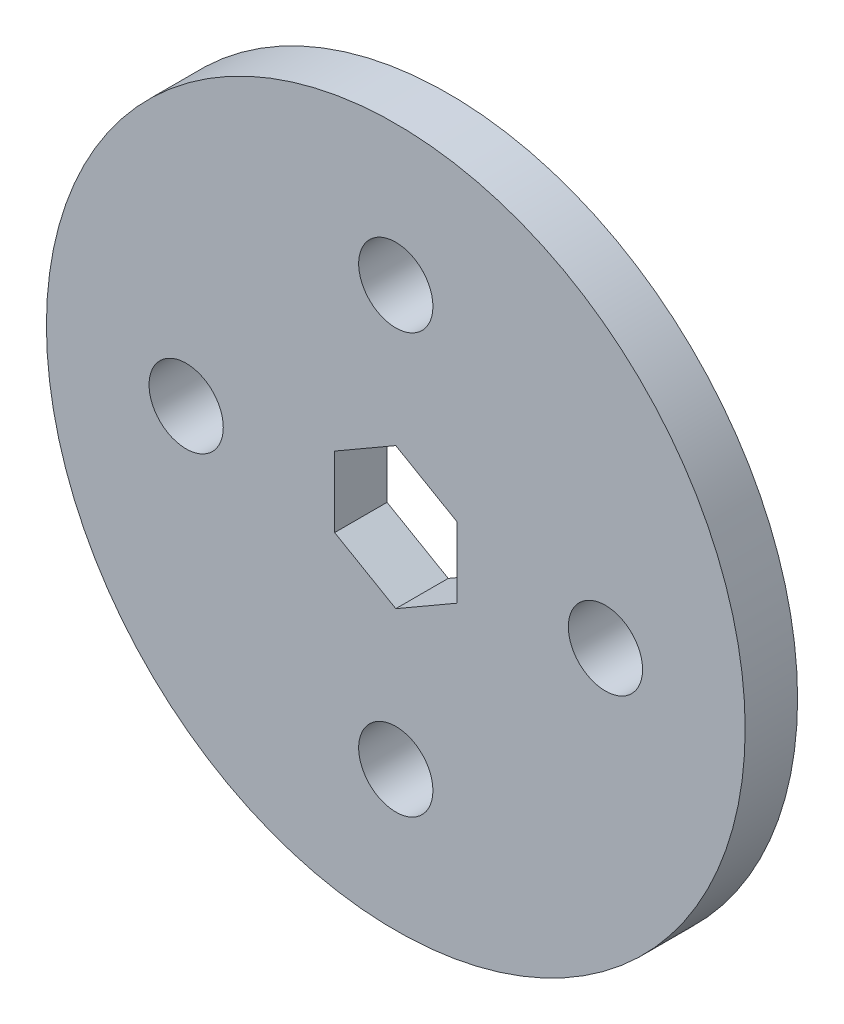
ISO-10303-21;
HEADER;
FILE_DESCRIPTION(('STEP AP214'),'2;1');
FILE_NAME('part.step','',(''),(''),'','','');
FILE_SCHEMA(('AUTOMOTIVE_DESIGN { 1 0 10303 214 1 1 1 1 }'));
ENDSEC;
DATA;
#1=APPLICATION_CONTEXT('core data for automotive mechanical design processes');
#2=APPLICATION_PROTOCOL_DEFINITION('international standard','automotive_design',2000,#1);
#3=PRODUCT_CONTEXT('',#1,'mechanical');
#4=PRODUCT('Part','Part','',(#3));
#5=PRODUCT_RELATED_PRODUCT_CATEGORY('part','',(#4));
#6=PRODUCT_DEFINITION_FORMATION('','',#4);
#7=PRODUCT_DEFINITION_CONTEXT('part definition',#1,'design');
#8=PRODUCT_DEFINITION('design','',#6,#7);
#9=PRODUCT_DEFINITION_SHAPE('','',#8);
#10=(LENGTH_UNIT() NAMED_UNIT(*) SI_UNIT(.MILLI.,.METRE.));
#11=(NAMED_UNIT(*) PLANE_ANGLE_UNIT() SI_UNIT($,.RADIAN.));
#12=(NAMED_UNIT(*) SI_UNIT($,.STERADIAN.) SOLID_ANGLE_UNIT());
#13=UNCERTAINTY_MEASURE_WITH_UNIT(LENGTH_MEASURE(1.E-05),#10,'distance_accuracy_value','');
#14=(GEOMETRIC_REPRESENTATION_CONTEXT(3) GLOBAL_UNCERTAINTY_ASSIGNED_CONTEXT((#13)) GLOBAL_UNIT_ASSIGNED_CONTEXT((#10,
#11,#12)) REPRESENTATION_CONTEXT('',''));
#15=CARTESIAN_POINT('',(0.,0.,0.));
#16=DIRECTION('',(0.,0.,1.));
#17=DIRECTION('',(1.,0.,0.));
#18=AXIS2_PLACEMENT_3D('',#15,#16,#17);
#19=CARTESIAN_POINT('',(0.,0.,3.));
#20=DIRECTION('',(0.,0.,-1.));
#21=DIRECTION('',(-1.,0.,0.));
#22=AXIS2_PLACEMENT_3D('',#19,#20,#21);
#23=CYLINDRICAL_SURFACE('',#22,20.);
#24=CARTESIAN_POINT('',(0.,0.,3.));
#25=DIRECTION('',(0.,0.,1.));
#26=DIRECTION('',(1.,0.,0.));
#27=AXIS2_PLACEMENT_3D('',#24,#25,#26);
#28=CIRCLE('',#27,20.);
#29=CARTESIAN_POINT('',(20.,0.,3.));
#30=VERTEX_POINT('',#29);
#31=EDGE_CURVE('E11',#30,#30,#28,.T.);
#32=ORIENTED_EDGE('',*,*,#31,.F.);
#33=EDGE_LOOP('',(#32));
#34=FACE_BOUND('',#33,.T.);
#35=CARTESIAN_POINT('',(0.,0.,0.));
#36=DIRECTION('',(0.,0.,1.));
#37=DIRECTION('',(1.,0.,0.));
#38=AXIS2_PLACEMENT_3D('',#35,#36,#37);
#39=CIRCLE('',#38,20.);
#40=CARTESIAN_POINT('',(20.,0.,0.));
#41=VERTEX_POINT('',#40);
#42=EDGE_CURVE('E54',#41,#41,#39,.T.);
#43=ORIENTED_EDGE('',*,*,#42,.T.);
#44=EDGE_LOOP('',(#43));
#45=FACE_BOUND('',#44,.T.);
#46=ADVANCED_FACE('F45',(#34,#45),#23,.T.);
#47=CARTESIAN_POINT('',(0.,0.,3.));
#48=DIRECTION('',(0.,0.,1.));
#49=DIRECTION('',(1.,0.,0.));
#50=AXIS2_PLACEMENT_3D('',#47,#48,#49);
#51=PLANE('',#50);
#52=CARTESIAN_POINT('',(0.,12.,3.));
#53=DIRECTION('',(0.,0.,1.));
#54=DIRECTION('',(1.,0.,0.));
#55=AXIS2_PLACEMENT_3D('',#52,#53,#54);
#56=CIRCLE('',#55,2.125);
#57=CARTESIAN_POINT('',(2.125,12.,3.));
#58=VERTEX_POINT('',#57);
#59=EDGE_CURVE('E181',#58,#58,#56,.T.);
#60=ORIENTED_EDGE('',*,*,#59,.F.);
#61=EDGE_LOOP('',(#60));
#62=FACE_BOUND('',#61,.T.);
#63=CARTESIAN_POINT('',(12.,0.,3.));
#64=DIRECTION('',(0.,0.,1.));
#65=DIRECTION('',(1.,0.,0.));
#66=AXIS2_PLACEMENT_3D('',#63,#64,#65);
#67=CIRCLE('',#66,2.125);
#68=CARTESIAN_POINT('',(14.125,0.,3.));
#69=VERTEX_POINT('',#68);
#70=EDGE_CURVE('E259',#69,#69,#67,.T.);
#71=ORIENTED_EDGE('',*,*,#70,.F.);
#72=EDGE_LOOP('',(#71));
#73=FACE_BOUND('',#72,.T.);
#74=CARTESIAN_POINT('',(0.,-12.,3.));
#75=DIRECTION('',(0.,0.,1.));
#76=DIRECTION('',(1.,0.,0.));
#77=AXIS2_PLACEMENT_3D('',#74,#75,#76);
#78=CIRCLE('',#77,2.125);
#79=CARTESIAN_POINT('',(2.12499999999992,-12.,3.));
#80=VERTEX_POINT('',#79);
#81=EDGE_CURVE('E251',#80,#80,#78,.T.);
#82=ORIENTED_EDGE('',*,*,#81,.F.);
#83=EDGE_LOOP('',(#82));
#84=FACE_BOUND('',#83,.T.);
#85=CARTESIAN_POINT('',(-12.,1.25693328198353E-13,3.));
#86=DIRECTION('',(0.,0.,1.));
#87=DIRECTION('',(1.,0.,0.));
#88=AXIS2_PLACEMENT_3D('',#85,#86,#87);
#89=CIRCLE('',#88,2.125);
#90=CARTESIAN_POINT('',(-9.875,1.25693328198353E-13,3.));
#91=VERTEX_POINT('',#90);
#92=EDGE_CURVE('E129',#91,#91,#89,.T.);
#93=ORIENTED_EDGE('',*,*,#92,.F.);
#94=EDGE_LOOP('',(#93));
#95=FACE_BOUND('',#94,.T.);
#96=DIRECTION('',(-0.866025403784442,0.499999999999994,0.));
#97=VECTOR('',#96,1.);
#98=CARTESIAN_POINT('',(3.49999999999999,2.02072594216372,3.));
#99=LINE('',#98,#97);
#100=CARTESIAN_POINT('',(3.49999999999999,2.02072594216372,3.));
#101=VERTEX_POINT('',#100);
#102=CARTESIAN_POINT('',(0.,4.04145188432738,3.));
#103=VERTEX_POINT('',#102);
#104=EDGE_CURVE('E62',#101,#103,#99,.T.);
#105=ORIENTED_EDGE('',*,*,#104,.F.);
#106=DIRECTION('',(0.,1.,0.));
#107=VECTOR('',#106,1.);
#108=CARTESIAN_POINT('',(3.50000000000002,-2.02072594216367,3.));
#109=LINE('',#108,#107);
#110=CARTESIAN_POINT('',(3.50000000000002,-2.02072594216367,3.));
#111=VERTEX_POINT('',#110);
#112=EDGE_CURVE('E122',#111,#101,#109,.T.);
#113=ORIENTED_EDGE('',*,*,#112,.F.);
#114=DIRECTION('',(0.866025403784435,0.500000000000006,0.));
#115=VECTOR('',#114,1.);
#116=CARTESIAN_POINT('',(0.,-4.04145188432738,3.));
#117=LINE('',#116,#115);
#118=CARTESIAN_POINT('',(0.,-4.04145188432738,3.));
#119=VERTEX_POINT('',#118);
#120=EDGE_CURVE('E126',#119,#111,#117,.T.);
#121=ORIENTED_EDGE('',*,*,#120,.F.);
#122=DIRECTION('',(0.866025403784442,-0.499999999999994,0.));
#123=VECTOR('',#122,1.);
#124=CARTESIAN_POINT('',(-3.49999999999998,-2.02072594216372,3.));
#125=LINE('',#124,#123);
#126=CARTESIAN_POINT('',(-3.49999999999998,-2.02072594216372,3.));
#127=VERTEX_POINT('',#126);
#128=EDGE_CURVE('E152',#127,#119,#125,.T.);
#129=ORIENTED_EDGE('',*,*,#128,.F.);
#130=DIRECTION('',(0.,-1.,0.));
#131=VECTOR('',#130,1.);
#132=CARTESIAN_POINT('',(-3.50000000000002,2.02072594216367,3.));
#133=LINE('',#132,#131);
#134=CARTESIAN_POINT('',(-3.50000000000002,2.02072594216367,3.));
#135=VERTEX_POINT('',#134);
#136=EDGE_CURVE('E148',#135,#127,#133,.T.);
#137=ORIENTED_EDGE('',*,*,#136,.F.);
#138=DIRECTION('',(-0.866025403784435,-0.500000000000006,0.));
#139=VECTOR('',#138,1.);
#140=CARTESIAN_POINT('',(0.,4.04145188432738,3.));
#141=LINE('',#140,#139);
#142=EDGE_CURVE('E145',#103,#135,#141,.T.);
#143=ORIENTED_EDGE('',*,*,#142,.F.);
#144=EDGE_LOOP('',(#105,#113,#121,#129,#137,#143));
#145=FACE_BOUND('',#144,.T.);
#146=ORIENTED_EDGE('',*,*,#31,.T.);
#147=EDGE_LOOP('',(#146));
#148=FACE_BOUND('',#147,.T.);
#149=ADVANCED_FACE('F207',(#62,#73,#84,#95,#145,#148),#51,.T.);
#150=CARTESIAN_POINT('',(0.,0.,0.));
#151=DIRECTION('',(0.,0.,1.));
#152=DIRECTION('',(1.,0.,0.));
#153=AXIS2_PLACEMENT_3D('',#150,#151,#152);
#154=PLANE('',#153);
#155=CARTESIAN_POINT('',(0.,12.,0.));
#156=DIRECTION('',(0.,0.,1.));
#157=DIRECTION('',(1.,0.,0.));
#158=AXIS2_PLACEMENT_3D('',#155,#156,#157);
#159=CIRCLE('',#158,2.125);
#160=CARTESIAN_POINT('',(2.125,12.,0.));
#161=VERTEX_POINT('',#160);
#162=EDGE_CURVE('E48',#161,#161,#159,.T.);
#163=ORIENTED_EDGE('',*,*,#162,.T.);
#164=EDGE_LOOP('',(#163));
#165=FACE_BOUND('',#164,.T.);
#166=CARTESIAN_POINT('',(12.,0.,0.));
#167=DIRECTION('',(0.,0.,1.));
#168=DIRECTION('',(1.,0.,0.));
#169=AXIS2_PLACEMENT_3D('',#166,#167,#168);
#170=CIRCLE('',#169,2.125);
#171=CARTESIAN_POINT('',(14.125,0.,0.));
#172=VERTEX_POINT('',#171);
#173=EDGE_CURVE('E184',#172,#172,#170,.T.);
#174=ORIENTED_EDGE('',*,*,#173,.T.);
#175=EDGE_LOOP('',(#174));
#176=FACE_BOUND('',#175,.T.);
#177=CARTESIAN_POINT('',(0.,-12.,0.));
#178=DIRECTION('',(0.,0.,1.));
#179=DIRECTION('',(1.,0.,0.));
#180=AXIS2_PLACEMENT_3D('',#177,#178,#179);
#181=CIRCLE('',#180,2.125);
#182=CARTESIAN_POINT('',(2.12499999999992,-12.,0.));
#183=VERTEX_POINT('',#182);
#184=EDGE_CURVE('E180',#183,#183,#181,.T.);
#185=ORIENTED_EDGE('',*,*,#184,.T.);
#186=EDGE_LOOP('',(#185));
#187=FACE_BOUND('',#186,.T.);
#188=CARTESIAN_POINT('',(-12.,1.25693328198353E-13,0.));
#189=DIRECTION('',(0.,0.,1.));
#190=DIRECTION('',(1.,0.,0.));
#191=AXIS2_PLACEMENT_3D('',#188,#189,#190);
#192=CIRCLE('',#191,2.125);
#193=CARTESIAN_POINT('',(-9.875,1.25693328198353E-13,0.));
#194=VERTEX_POINT('',#193);
#195=EDGE_CURVE('E176',#194,#194,#192,.T.);
#196=ORIENTED_EDGE('',*,*,#195,.T.);
#197=EDGE_LOOP('',(#196));
#198=FACE_BOUND('',#197,.T.);
#199=DIRECTION('',(0.,1.,0.));
#200=VECTOR('',#199,1.);
#201=CARTESIAN_POINT('',(3.50000000000002,-2.02072594216367,0.));
#202=LINE('',#201,#200);
#203=CARTESIAN_POINT('',(3.50000000000002,-2.02072594216367,0.));
#204=VERTEX_POINT('',#203);
#205=CARTESIAN_POINT('',(3.49999999999999,2.02072594216372,0.));
#206=VERTEX_POINT('',#205);
#207=EDGE_CURVE('E109',#204,#206,#202,.T.);
#208=ORIENTED_EDGE('',*,*,#207,.T.);
#209=DIRECTION('',(-0.866025403784442,0.499999999999994,0.));
#210=VECTOR('',#209,1.);
#211=CARTESIAN_POINT('',(3.49999999999999,2.02072594216372,0.));
#212=LINE('',#211,#210);
#213=CARTESIAN_POINT('',(0.,4.04145188432738,0.));
#214=VERTEX_POINT('',#213);
#215=EDGE_CURVE('E102',#206,#214,#212,.T.);
#216=ORIENTED_EDGE('',*,*,#215,.T.);
#217=DIRECTION('',(-0.866025403784435,-0.500000000000006,0.));
#218=VECTOR('',#217,1.);
#219=CARTESIAN_POINT('',(0.,4.04145188432738,0.));
#220=LINE('',#219,#218);
#221=CARTESIAN_POINT('',(-3.50000000000002,2.02072594216366,0.));
#222=VERTEX_POINT('',#221);
#223=EDGE_CURVE('E112',#214,#222,#220,.T.);
#224=ORIENTED_EDGE('',*,*,#223,.T.);
#225=DIRECTION('',(0.,-1.,0.));
#226=VECTOR('',#225,1.);
#227=CARTESIAN_POINT('',(-3.50000000000002,2.02072594216367,0.));
#228=LINE('',#227,#226);
#229=CARTESIAN_POINT('',(-3.49999999999998,-2.02072594216372,0.));
#230=VERTEX_POINT('',#229);
#231=EDGE_CURVE('E70',#222,#230,#228,.T.);
#232=ORIENTED_EDGE('',*,*,#231,.T.);
#233=DIRECTION('',(0.866025403784442,-0.499999999999994,0.));
#234=VECTOR('',#233,1.);
#235=CARTESIAN_POINT('',(-3.49999999999998,-2.02072594216372,0.));
#236=LINE('',#235,#234);
#237=CARTESIAN_POINT('',(0.,-4.04145188432738,0.));
#238=VERTEX_POINT('',#237);
#239=EDGE_CURVE('E134',#230,#238,#236,.T.);
#240=ORIENTED_EDGE('',*,*,#239,.T.);
#241=DIRECTION('',(0.866025403784435,0.500000000000006,0.));
#242=VECTOR('',#241,1.);
#243=CARTESIAN_POINT('',(0.,-4.04145188432738,0.));
#244=LINE('',#243,#242);
#245=EDGE_CURVE('E138',#238,#204,#244,.T.);
#246=ORIENTED_EDGE('',*,*,#245,.T.);
#247=EDGE_LOOP('',(#208,#216,#224,#232,#240,#246));
#248=FACE_BOUND('',#247,.T.);
#249=ORIENTED_EDGE('',*,*,#42,.F.);
#250=EDGE_LOOP('',(#249));
#251=FACE_BOUND('',#250,.T.);
#252=ADVANCED_FACE('F117',(#165,#176,#187,#198,#248,#251),#154,.F.);
#253=CARTESIAN_POINT('',(3.49999999999999,2.02072594216372,0.));
#254=DIRECTION('',(0.499999999999994,0.866025403784442,0.));
#255=DIRECTION('',(-0.866025403784442,0.499999999999994,0.));
#256=AXIS2_PLACEMENT_3D('',#253,#254,#255);
#257=PLANE('',#256);
#258=ORIENTED_EDGE('',*,*,#104,.T.);
#259=DIRECTION('',(0.,0.,1.));
#260=VECTOR('',#259,1.);
#261=CARTESIAN_POINT('',(0.,4.04145188432738,0.));
#262=LINE('',#261,#260);
#263=EDGE_CURVE('E98',#214,#103,#262,.T.);
#264=ORIENTED_EDGE('',*,*,#263,.F.);
#265=ORIENTED_EDGE('',*,*,#215,.F.);
#266=DIRECTION('',(0.,0.,1.));
#267=VECTOR('',#266,1.);
#268=CARTESIAN_POINT('',(3.49999999999999,2.02072594216372,0.));
#269=LINE('',#268,#267);
#270=EDGE_CURVE('E159',#206,#101,#269,.T.);
#271=ORIENTED_EDGE('',*,*,#270,.T.);
#272=EDGE_LOOP('',(#258,#264,#265,#271));
#273=FACE_BOUND('',#272,.T.);
#274=ADVANCED_FACE('F100',(#273),#257,.F.);
#275=CARTESIAN_POINT('',(3.50000000000002,-2.02072594216367,0.));
#276=DIRECTION('',(1.,0.,0.));
#277=DIRECTION('',(0.,1.,0.));
#278=AXIS2_PLACEMENT_3D('',#275,#276,#277);
#279=PLANE('',#278);
#280=ORIENTED_EDGE('',*,*,#112,.T.);
#281=ORIENTED_EDGE('',*,*,#270,.F.);
#282=ORIENTED_EDGE('',*,*,#207,.F.);
#283=DIRECTION('',(0.,0.,1.));
#284=VECTOR('',#283,1.);
#285=CARTESIAN_POINT('',(3.50000000000002,-2.02072594216367,0.));
#286=LINE('',#285,#284);
#287=EDGE_CURVE('E162',#204,#111,#286,.T.);
#288=ORIENTED_EDGE('',*,*,#287,.T.);
#289=EDGE_LOOP('',(#280,#281,#282,#288));
#290=FACE_BOUND('',#289,.T.);
#291=ADVANCED_FACE('F222',(#290),#279,.F.);
#292=CARTESIAN_POINT('',(0.,-4.04145188432738,0.));
#293=DIRECTION('',(0.500000000000006,-0.866025403784435,0.));
#294=DIRECTION('',(0.866025403784435,0.500000000000006,0.));
#295=AXIS2_PLACEMENT_3D('',#292,#293,#294);
#296=PLANE('',#295);
#297=ORIENTED_EDGE('',*,*,#120,.T.);
#298=ORIENTED_EDGE('',*,*,#287,.F.);
#299=ORIENTED_EDGE('',*,*,#245,.F.);
#300=DIRECTION('',(0.,0.,1.));
#301=VECTOR('',#300,1.);
#302=CARTESIAN_POINT('',(0.,-4.04145188432738,0.));
#303=LINE('',#302,#301);
#304=EDGE_CURVE('E165',#238,#119,#303,.T.);
#305=ORIENTED_EDGE('',*,*,#304,.T.);
#306=EDGE_LOOP('',(#297,#298,#299,#305));
#307=FACE_BOUND('',#306,.T.);
#308=ADVANCED_FACE('F234',(#307),#296,.F.);
#309=CARTESIAN_POINT('',(-3.49999999999998,-2.02072594216372,0.));
#310=DIRECTION('',(-0.499999999999993,-0.866025403784442,0.));
#311=DIRECTION('',(0.866025403784443,-0.499999999999994,0.));
#312=AXIS2_PLACEMENT_3D('',#309,#310,#311);
#313=PLANE('',#312);
#314=ORIENTED_EDGE('',*,*,#128,.T.);
#315=ORIENTED_EDGE('',*,*,#304,.F.);
#316=ORIENTED_EDGE('',*,*,#239,.F.);
#317=DIRECTION('',(0.,0.,1.));
#318=VECTOR('',#317,1.);
#319=CARTESIAN_POINT('',(-3.49999999999998,-2.02072594216372,0.));
#320=LINE('',#319,#318);
#321=EDGE_CURVE('E168',#230,#127,#320,.T.);
#322=ORIENTED_EDGE('',*,*,#321,.T.);
#323=EDGE_LOOP('',(#314,#315,#316,#322));
#324=FACE_BOUND('',#323,.T.);
#325=ADVANCED_FACE('F231',(#324),#313,.F.);
#326=CARTESIAN_POINT('',(-3.50000000000002,2.02072594216367,0.));
#327=DIRECTION('',(-1.,0.,0.));
#328=DIRECTION('',(0.,-1.,0.));
#329=AXIS2_PLACEMENT_3D('',#326,#327,#328);
#330=PLANE('',#329);
#331=ORIENTED_EDGE('',*,*,#136,.T.);
#332=ORIENTED_EDGE('',*,*,#321,.F.);
#333=ORIENTED_EDGE('',*,*,#231,.F.);
#334=DIRECTION('',(0.,0.,1.));
#335=VECTOR('',#334,1.);
#336=CARTESIAN_POINT('',(-3.50000000000002,2.02072594216367,0.));
#337=LINE('',#336,#335);
#338=EDGE_CURVE('E108',#222,#135,#337,.T.);
#339=ORIENTED_EDGE('',*,*,#338,.T.);
#340=EDGE_LOOP('',(#331,#332,#333,#339));
#341=FACE_BOUND('',#340,.T.);
#342=ADVANCED_FACE('F228',(#341),#330,.F.);
#343=CARTESIAN_POINT('',(0.,4.04145188432738,0.));
#344=DIRECTION('',(-0.500000000000006,0.866025403784435,0.));
#345=DIRECTION('',(-0.866025403784435,-0.500000000000006,0.));
#346=AXIS2_PLACEMENT_3D('',#343,#344,#345);
#347=PLANE('',#346);
#348=ORIENTED_EDGE('',*,*,#142,.T.);
#349=ORIENTED_EDGE('',*,*,#338,.F.);
#350=ORIENTED_EDGE('',*,*,#223,.F.);
#351=ORIENTED_EDGE('',*,*,#263,.T.);
#352=EDGE_LOOP('',(#348,#349,#350,#351));
#353=FACE_BOUND('',#352,.T.);
#354=ADVANCED_FACE('F113',(#353),#347,.F.);
#355=CARTESIAN_POINT('',(-12.,1.25693328198353E-13,-7.));
#356=DIRECTION('',(0.,0.,1.));
#357=DIRECTION('',(1.,0.,0.));
#358=AXIS2_PLACEMENT_3D('',#355,#356,#357);
#359=CYLINDRICAL_SURFACE('',#358,2.125);
#360=ORIENTED_EDGE('',*,*,#92,.T.);
#361=EDGE_LOOP('',(#360));
#362=FACE_BOUND('',#361,.T.);
#363=ORIENTED_EDGE('',*,*,#195,.F.);
#364=EDGE_LOOP('',(#363));
#365=FACE_BOUND('',#364,.T.);
#366=ADVANCED_FACE('F227',(#362,#365),#359,.F.);
#367=CARTESIAN_POINT('',(0.,-12.,-7.));
#368=DIRECTION('',(0.,0.,1.));
#369=DIRECTION('',(1.,0.,0.));
#370=AXIS2_PLACEMENT_3D('',#367,#368,#369);
#371=CYLINDRICAL_SURFACE('',#370,2.125);
#372=ORIENTED_EDGE('',*,*,#81,.T.);
#373=EDGE_LOOP('',(#372));
#374=FACE_BOUND('',#373,.T.);
#375=ORIENTED_EDGE('',*,*,#184,.F.);
#376=EDGE_LOOP('',(#375));
#377=FACE_BOUND('',#376,.T.);
#378=ADVANCED_FACE('F202',(#374,#377),#371,.F.);
#379=CARTESIAN_POINT('',(12.,0.,-7.));
#380=DIRECTION('',(0.,0.,1.));
#381=DIRECTION('',(1.,0.,0.));
#382=AXIS2_PLACEMENT_3D('',#379,#380,#381);
#383=CYLINDRICAL_SURFACE('',#382,2.125);
#384=ORIENTED_EDGE('',*,*,#70,.T.);
#385=EDGE_LOOP('',(#384));
#386=FACE_BOUND('',#385,.T.);
#387=ORIENTED_EDGE('',*,*,#173,.F.);
#388=EDGE_LOOP('',(#387));
#389=FACE_BOUND('',#388,.T.);
#390=ADVANCED_FACE('F196',(#386,#389),#383,.F.);
#391=CARTESIAN_POINT('',(0.,12.,-7.));
#392=DIRECTION('',(0.,0.,1.));
#393=DIRECTION('',(1.,0.,0.));
#394=AXIS2_PLACEMENT_3D('',#391,#392,#393);
#395=CYLINDRICAL_SURFACE('',#394,2.125);
#396=ORIENTED_EDGE('',*,*,#59,.T.);
#397=EDGE_LOOP('',(#396));
#398=FACE_BOUND('',#397,.T.);
#399=ORIENTED_EDGE('',*,*,#162,.F.);
#400=EDGE_LOOP('',(#399));
#401=FACE_BOUND('',#400,.T.);
#402=ADVANCED_FACE('F194',(#398,#401),#395,.F.);
#403=CLOSED_SHELL('',(#46,#149,#252,#274,#291,#308,#325,#342,#354,#366,#378,#390,#402));
#404=MANIFOLD_SOLID_BREP('B2',#403);
#405=ADVANCED_BREP_SHAPE_REPRESENTATION('',(#18,#404),#14);
#406=SHAPE_DEFINITION_REPRESENTATION(#9,#405);
ENDSEC;
END-ISO-10303-21;
